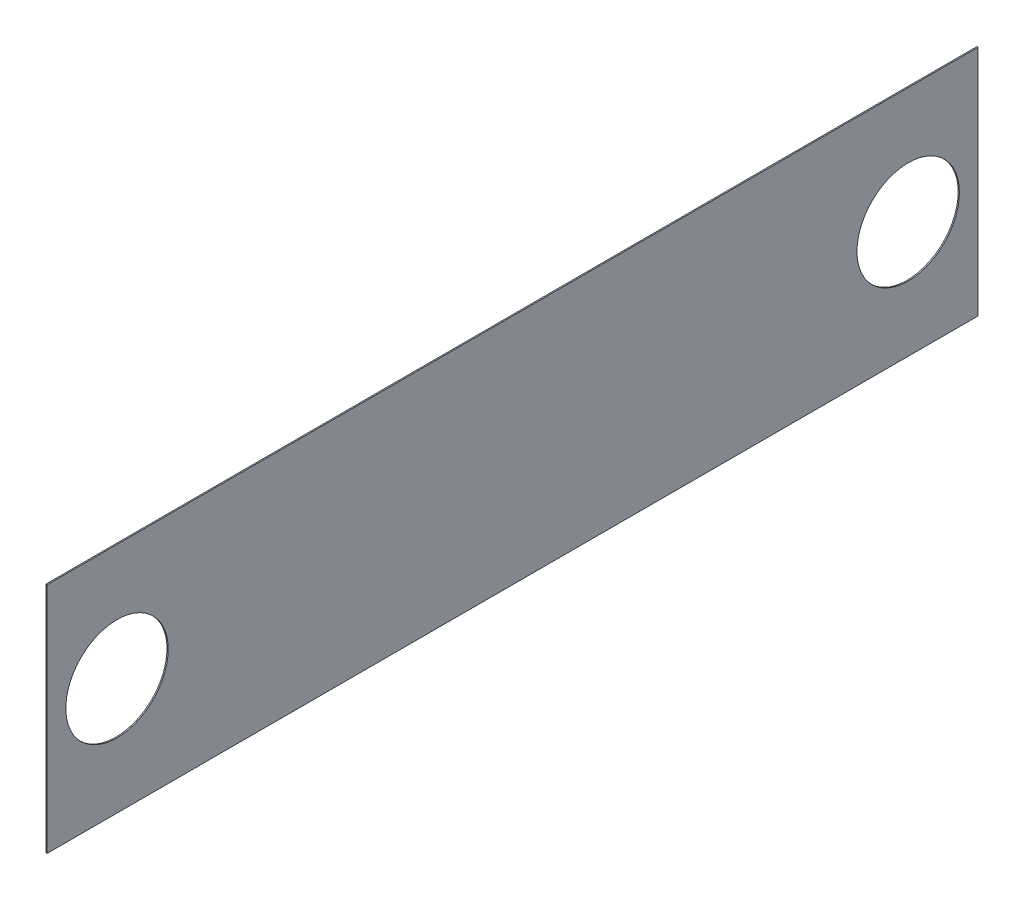
ISO-10303-21;
HEADER;
FILE_DESCRIPTION(('STEP AP214'),'2;1');
FILE_NAME('part.step','',(''),(''),'','','');
FILE_SCHEMA(('AUTOMOTIVE_DESIGN { 1 0 10303 214 1 1 1 1 }'));
ENDSEC;
DATA;
#1=APPLICATION_CONTEXT('core data for automotive mechanical design processes');
#2=APPLICATION_PROTOCOL_DEFINITION('international standard','automotive_design',2000,#1);
#3=PRODUCT_CONTEXT('',#1,'mechanical');
#4=PRODUCT('Part','Part','',(#3));
#5=PRODUCT_RELATED_PRODUCT_CATEGORY('part','',(#4));
#6=PRODUCT_DEFINITION_FORMATION('','',#4);
#7=PRODUCT_DEFINITION_CONTEXT('part definition',#1,'design');
#8=PRODUCT_DEFINITION('design','',#6,#7);
#9=PRODUCT_DEFINITION_SHAPE('','',#8);
#10=(LENGTH_UNIT() NAMED_UNIT(*) SI_UNIT(.MILLI.,.METRE.));
#11=(NAMED_UNIT(*) PLANE_ANGLE_UNIT() SI_UNIT($,.RADIAN.));
#12=(NAMED_UNIT(*) SI_UNIT($,.STERADIAN.) SOLID_ANGLE_UNIT());
#13=UNCERTAINTY_MEASURE_WITH_UNIT(LENGTH_MEASURE(1.E-05),#10,'distance_accuracy_value','');
#14=(GEOMETRIC_REPRESENTATION_CONTEXT(3) GLOBAL_UNCERTAINTY_ASSIGNED_CONTEXT((#13)) GLOBAL_UNIT_ASSIGNED_CONTEXT((#10,
#11,#12)) REPRESENTATION_CONTEXT('',''));
#15=CARTESIAN_POINT('',(0.,0.,0.));
#16=DIRECTION('',(0.,0.,1.));
#17=DIRECTION('',(1.,0.,0.));
#18=AXIS2_PLACEMENT_3D('',#15,#16,#17);
#19=CARTESIAN_POINT('',(0.127,12.5,50.));
#20=DIRECTION('',(0.,0.,-1.));
#21=DIRECTION('',(-1.,0.,0.));
#22=AXIS2_PLACEMENT_3D('',#19,#20,#21);
#23=PLANE('',#22);
#24=DIRECTION('',(0.,-1.,0.));
#25=VECTOR('',#24,1.);
#26=CARTESIAN_POINT('',(0.,12.5,50.));
#27=LINE('',#26,#25);
#28=CARTESIAN_POINT('',(0.,12.5,50.));
#29=VERTEX_POINT('',#28);
#30=CARTESIAN_POINT('',(0.,-12.5,50.));
#31=VERTEX_POINT('',#30);
#32=EDGE_CURVE('E97',#29,#31,#27,.T.);
#33=ORIENTED_EDGE('',*,*,#32,.T.);
#34=DIRECTION('',(-1.,0.,0.));
#35=VECTOR('',#34,1.);
#36=CARTESIAN_POINT('',(0.127,-12.5,50.));
#37=LINE('',#36,#35);
#38=CARTESIAN_POINT('',(0.127,-12.5,50.));
#39=VERTEX_POINT('',#38);
#40=EDGE_CURVE('E11',#39,#31,#37,.T.);
#41=ORIENTED_EDGE('',*,*,#40,.F.);
#42=DIRECTION('',(0.,-1.,0.));
#43=VECTOR('',#42,1.);
#44=CARTESIAN_POINT('',(0.127,12.5,50.));
#45=LINE('',#44,#43);
#46=CARTESIAN_POINT('',(0.127,12.5,50.));
#47=VERTEX_POINT('',#46);
#48=EDGE_CURVE('E85',#47,#39,#45,.T.);
#49=ORIENTED_EDGE('',*,*,#48,.F.);
#50=DIRECTION('',(-1.,0.,0.));
#51=VECTOR('',#50,1.);
#52=CARTESIAN_POINT('',(0.127,12.5,50.));
#53=LINE('',#52,#51);
#54=EDGE_CURVE('E93',#47,#29,#53,.T.);
#55=ORIENTED_EDGE('',*,*,#54,.T.);
#56=EDGE_LOOP('',(#33,#41,#49,#55));
#57=FACE_BOUND('',#56,.T.);
#58=ADVANCED_FACE('F34',(#57),#23,.F.);
#59=CARTESIAN_POINT('',(0.127,-12.5,50.));
#60=DIRECTION('',(0.,1.,0.));
#61=DIRECTION('',(0.,0.,1.));
#62=AXIS2_PLACEMENT_3D('',#59,#60,#61);
#63=PLANE('',#62);
#64=DIRECTION('',(0.,0.,-1.));
#65=VECTOR('',#64,1.);
#66=CARTESIAN_POINT('',(0.,-12.5,50.));
#67=LINE('',#66,#65);
#68=CARTESIAN_POINT('',(0.,-12.5,-50.));
#69=VERTEX_POINT('',#68);
#70=EDGE_CURVE('E89',#31,#69,#67,.T.);
#71=ORIENTED_EDGE('',*,*,#70,.T.);
#72=DIRECTION('',(-1.,0.,0.));
#73=VECTOR('',#72,1.);
#74=CARTESIAN_POINT('',(0.127,-12.5,-50.));
#75=LINE('',#74,#73);
#76=CARTESIAN_POINT('',(0.127,-12.5,-50.));
#77=VERTEX_POINT('',#76);
#78=EDGE_CURVE('E42',#77,#69,#75,.T.);
#79=ORIENTED_EDGE('',*,*,#78,.F.);
#80=DIRECTION('',(0.,0.,-1.));
#81=VECTOR('',#80,1.);
#82=CARTESIAN_POINT('',(0.127,-12.5,50.));
#83=LINE('',#82,#81);
#84=EDGE_CURVE('E80',#39,#77,#83,.T.);
#85=ORIENTED_EDGE('',*,*,#84,.F.);
#86=ORIENTED_EDGE('',*,*,#40,.T.);
#87=EDGE_LOOP('',(#71,#79,#85,#86));
#88=FACE_BOUND('',#87,.T.);
#89=ADVANCED_FACE('F88',(#88),#63,.F.);
#90=CARTESIAN_POINT('',(0.127,12.5,-50.));
#91=DIRECTION('',(0.,0.,1.));
#92=DIRECTION('',(1.,0.,0.));
#93=AXIS2_PLACEMENT_3D('',#90,#91,#92);
#94=PLANE('',#93);
#95=DIRECTION('',(0.,1.,0.));
#96=VECTOR('',#95,1.);
#97=CARTESIAN_POINT('',(0.,12.5,-50.));
#98=LINE('',#97,#96);
#99=CARTESIAN_POINT('',(0.,12.5,-50.));
#100=VERTEX_POINT('',#99);
#101=EDGE_CURVE('E67',#69,#100,#98,.T.);
#102=ORIENTED_EDGE('',*,*,#101,.T.);
#103=DIRECTION('',(-1.,0.,0.));
#104=VECTOR('',#103,1.);
#105=CARTESIAN_POINT('',(0.127,12.5,-50.));
#106=LINE('',#105,#104);
#107=CARTESIAN_POINT('',(0.127,12.5,-50.));
#108=VERTEX_POINT('',#107);
#109=EDGE_CURVE('E90',#108,#100,#106,.T.);
#110=ORIENTED_EDGE('',*,*,#109,.F.);
#111=DIRECTION('',(0.,1.,0.));
#112=VECTOR('',#111,1.);
#113=CARTESIAN_POINT('',(0.127,12.5,-50.));
#114=LINE('',#113,#112);
#115=EDGE_CURVE('E83',#77,#108,#114,.T.);
#116=ORIENTED_EDGE('',*,*,#115,.F.);
#117=ORIENTED_EDGE('',*,*,#78,.T.);
#118=EDGE_LOOP('',(#102,#110,#116,#117));
#119=FACE_BOUND('',#118,.T.);
#120=ADVANCED_FACE('F91',(#119),#94,.F.);
#121=CARTESIAN_POINT('',(0.127,12.5,50.));
#122=DIRECTION('',(0.,-1.,0.));
#123=DIRECTION('',(0.,0.,-1.));
#124=AXIS2_PLACEMENT_3D('',#121,#122,#123);
#125=PLANE('',#124);
#126=DIRECTION('',(0.,0.,1.));
#127=VECTOR('',#126,1.);
#128=CARTESIAN_POINT('',(0.,12.5,50.));
#129=LINE('',#128,#127);
#130=EDGE_CURVE('E73',#100,#29,#129,.T.);
#131=ORIENTED_EDGE('',*,*,#130,.T.);
#132=ORIENTED_EDGE('',*,*,#54,.F.);
#133=DIRECTION('',(0.,0.,1.));
#134=VECTOR('',#133,1.);
#135=CARTESIAN_POINT('',(0.127,12.5,50.));
#136=LINE('',#135,#134);
#137=EDGE_CURVE('E50',#108,#47,#136,.T.);
#138=ORIENTED_EDGE('',*,*,#137,.F.);
#139=ORIENTED_EDGE('',*,*,#109,.T.);
#140=EDGE_LOOP('',(#131,#132,#138,#139));
#141=FACE_BOUND('',#140,.T.);
#142=ADVANCED_FACE('F105',(#141),#125,.F.);
#143=CARTESIAN_POINT('',(0.127,0.,0.));
#144=DIRECTION('',(1.,0.,0.));
#145=DIRECTION('',(0.,0.,-1.));
#146=AXIS2_PLACEMENT_3D('',#143,#144,#145);
#147=PLANE('',#146);
#148=CARTESIAN_POINT('',(0.127000000000001,0.,42.5));
#149=DIRECTION('',(1.,0.,0.));
#150=DIRECTION('',(0.,0.,-1.));
#151=AXIS2_PLACEMENT_3D('',#148,#149,#150);
#152=CIRCLE('',#151,5.5);
#153=CARTESIAN_POINT('',(0.127000000000001,0.,37.));
#154=VERTEX_POINT('',#153);
#155=EDGE_CURVE('E119',#154,#154,#152,.T.);
#156=ORIENTED_EDGE('',*,*,#155,.F.);
#157=EDGE_LOOP('',(#156));
#158=FACE_BOUND('',#157,.T.);
#159=CARTESIAN_POINT('',(0.127000000000001,0.,-42.5));
#160=DIRECTION('',(1.,0.,0.));
#161=DIRECTION('',(0.,0.,-1.));
#162=AXIS2_PLACEMENT_3D('',#159,#160,#161);
#163=CIRCLE('',#162,5.5);
#164=CARTESIAN_POINT('',(0.127000000000001,0.,-48.));
#165=VERTEX_POINT('',#164);
#166=EDGE_CURVE('E113',#165,#165,#163,.T.);
#167=ORIENTED_EDGE('',*,*,#166,.F.);
#168=EDGE_LOOP('',(#167));
#169=FACE_BOUND('',#168,.T.);
#170=ORIENTED_EDGE('',*,*,#48,.T.);
#171=ORIENTED_EDGE('',*,*,#84,.T.);
#172=ORIENTED_EDGE('',*,*,#115,.T.);
#173=ORIENTED_EDGE('',*,*,#137,.T.);
#174=EDGE_LOOP('',(#170,#171,#172,#173));
#175=FACE_BOUND('',#174,.T.);
#176=ADVANCED_FACE('F81',(#158,#169,#175),#147,.T.);
#177=CARTESIAN_POINT('',(0.,0.,0.));
#178=DIRECTION('',(1.,0.,0.));
#179=DIRECTION('',(0.,0.,-1.));
#180=AXIS2_PLACEMENT_3D('',#177,#178,#179);
#181=PLANE('',#180);
#182=CARTESIAN_POINT('',(0.,0.,42.5));
#183=DIRECTION('',(1.,0.,0.));
#184=DIRECTION('',(0.,0.,-1.));
#185=AXIS2_PLACEMENT_3D('',#182,#183,#184);
#186=CIRCLE('',#185,5.5);
#187=CARTESIAN_POINT('',(0.,0.,37.));
#188=VERTEX_POINT('',#187);
#189=EDGE_CURVE('E116',#188,#188,#186,.T.);
#190=ORIENTED_EDGE('',*,*,#189,.T.);
#191=EDGE_LOOP('',(#190));
#192=FACE_BOUND('',#191,.T.);
#193=CARTESIAN_POINT('',(0.,0.,-42.5));
#194=DIRECTION('',(1.,0.,0.));
#195=DIRECTION('',(0.,0.,-1.));
#196=AXIS2_PLACEMENT_3D('',#193,#194,#195);
#197=CIRCLE('',#196,5.5);
#198=CARTESIAN_POINT('',(0.,0.,-48.));
#199=VERTEX_POINT('',#198);
#200=EDGE_CURVE('E100',#199,#199,#197,.T.);
#201=ORIENTED_EDGE('',*,*,#200,.T.);
#202=EDGE_LOOP('',(#201));
#203=FACE_BOUND('',#202,.T.);
#204=ORIENTED_EDGE('',*,*,#32,.F.);
#205=ORIENTED_EDGE('',*,*,#130,.F.);
#206=ORIENTED_EDGE('',*,*,#101,.F.);
#207=ORIENTED_EDGE('',*,*,#70,.F.);
#208=EDGE_LOOP('',(#204,#205,#206,#207));
#209=FACE_BOUND('',#208,.T.);
#210=ADVANCED_FACE('F108',(#192,#203,#209),#181,.F.);
#211=CARTESIAN_POINT('',(0.127,0.,-42.5));
#212=DIRECTION('',(1.,0.,0.));
#213=DIRECTION('',(0.,0.,-1.));
#214=AXIS2_PLACEMENT_3D('',#211,#212,#213);
#215=CYLINDRICAL_SURFACE('',#214,5.5);
#216=ORIENTED_EDGE('',*,*,#200,.F.);
#217=EDGE_LOOP('',(#216));
#218=FACE_BOUND('',#217,.T.);
#219=ORIENTED_EDGE('',*,*,#166,.T.);
#220=EDGE_LOOP('',(#219));
#221=FACE_BOUND('',#220,.T.);
#222=ADVANCED_FACE('F130',(#218,#221),#215,.F.);
#223=CARTESIAN_POINT('',(0.127,0.,42.5));
#224=DIRECTION('',(1.,0.,0.));
#225=DIRECTION('',(0.,0.,-1.));
#226=AXIS2_PLACEMENT_3D('',#223,#224,#225);
#227=CYLINDRICAL_SURFACE('',#226,5.5);
#228=ORIENTED_EDGE('',*,*,#189,.F.);
#229=EDGE_LOOP('',(#228));
#230=FACE_BOUND('',#229,.T.);
#231=ORIENTED_EDGE('',*,*,#155,.T.);
#232=EDGE_LOOP('',(#231));
#233=FACE_BOUND('',#232,.T.);
#234=ADVANCED_FACE('F123',(#230,#233),#227,.F.);
#235=CLOSED_SHELL('',(#58,#89,#120,#142,#176,#210,#222,#234));
#236=MANIFOLD_SOLID_BREP('B2',#235);
#237=ADVANCED_BREP_SHAPE_REPRESENTATION('',(#18,#236),#14);
#238=SHAPE_DEFINITION_REPRESENTATION(#9,#237);
ENDSEC;
END-ISO-10303-21;
